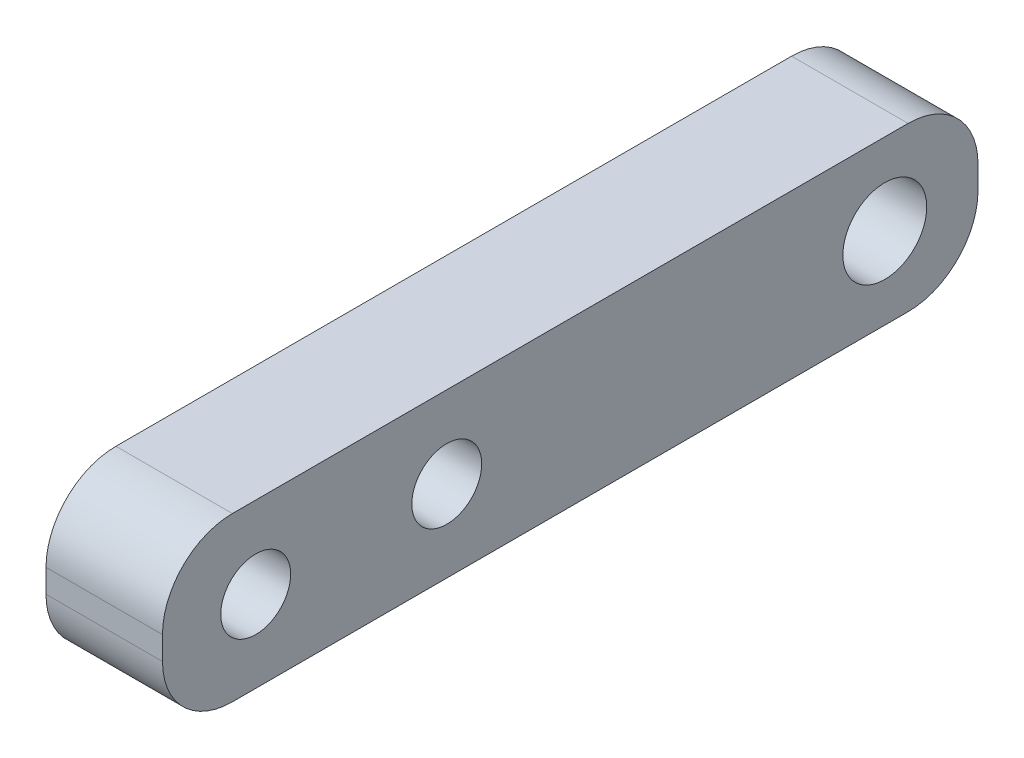
ISO-10303-21;
HEADER;
FILE_DESCRIPTION(('STEP AP214'),'2;1');
FILE_NAME('part.step','',(''),(''),'','','');
FILE_SCHEMA(('AUTOMOTIVE_DESIGN { 1 0 10303 214 1 1 1 1 }'));
ENDSEC;
DATA;
#1=APPLICATION_CONTEXT('core data for automotive mechanical design processes');
#2=APPLICATION_PROTOCOL_DEFINITION('international standard','automotive_design',2000,#1);
#3=PRODUCT_CONTEXT('',#1,'mechanical');
#4=PRODUCT('Part','Part','',(#3));
#5=PRODUCT_RELATED_PRODUCT_CATEGORY('part','',(#4));
#6=PRODUCT_DEFINITION_FORMATION('','',#4);
#7=PRODUCT_DEFINITION_CONTEXT('part definition',#1,'design');
#8=PRODUCT_DEFINITION('design','',#6,#7);
#9=PRODUCT_DEFINITION_SHAPE('','',#8);
#10=(LENGTH_UNIT() NAMED_UNIT(*) SI_UNIT(.MILLI.,.METRE.));
#11=(NAMED_UNIT(*) PLANE_ANGLE_UNIT() SI_UNIT($,.RADIAN.));
#12=(NAMED_UNIT(*) SI_UNIT($,.STERADIAN.) SOLID_ANGLE_UNIT());
#13=UNCERTAINTY_MEASURE_WITH_UNIT(LENGTH_MEASURE(1.E-05),#10,'distance_accuracy_value','');
#14=(GEOMETRIC_REPRESENTATION_CONTEXT(3) GLOBAL_UNCERTAINTY_ASSIGNED_CONTEXT((#13)) GLOBAL_UNIT_ASSIGNED_CONTEXT((#10,
#11,#12)) REPRESENTATION_CONTEXT('',''));
#15=CARTESIAN_POINT('',(0.,0.,0.));
#16=DIRECTION('',(0.,0.,1.));
#17=DIRECTION('',(1.,0.,0.));
#18=AXIS2_PLACEMENT_3D('',#15,#16,#17);
#19=CARTESIAN_POINT('',(5.,0.,0.));
#20=DIRECTION('',(0.,0.,-1.));
#21=DIRECTION('',(0.,1.,0.));
#22=AXIS2_PLACEMENT_3D('',#19,#20,#21);
#23=PLANE('',#22);
#24=DIRECTION('',(0.,-1.,0.));
#25=VECTOR('',#24,1.);
#26=CARTESIAN_POINT('',(5.,0.,0.));
#27=LINE('',#26,#25);
#28=CARTESIAN_POINT('',(5.,-3.,0.));
#29=VERTEX_POINT('',#28);
#30=CARTESIAN_POINT('',(5.,-4.,0.));
#31=VERTEX_POINT('',#30);
#32=EDGE_CURVE('E128',#29,#31,#27,.T.);
#33=ORIENTED_EDGE('',*,*,#32,.F.);
#34=DIRECTION('',(-1.,0.,0.));
#35=VECTOR('',#34,1.);
#36=CARTESIAN_POINT('',(5.,-3.,0.));
#37=LINE('',#36,#35);
#38=CARTESIAN_POINT('',(0.,-3.,0.));
#39=VERTEX_POINT('',#38);
#40=EDGE_CURVE('E11',#29,#39,#37,.T.);
#41=ORIENTED_EDGE('',*,*,#40,.T.);
#42=DIRECTION('',(0.,-1.,0.));
#43=VECTOR('',#42,1.);
#44=CARTESIAN_POINT('',(0.,0.,0.));
#45=LINE('',#44,#43);
#46=CARTESIAN_POINT('',(0.,-4.,0.));
#47=VERTEX_POINT('',#46);
#48=EDGE_CURVE('E130',#39,#47,#45,.T.);
#49=ORIENTED_EDGE('',*,*,#48,.T.);
#50=DIRECTION('',(-1.,0.,0.));
#51=VECTOR('',#50,1.);
#52=CARTESIAN_POINT('',(5.,-4.,0.));
#53=LINE('',#52,#51);
#54=EDGE_CURVE('E41',#47,#31,#53,.F.);
#55=ORIENTED_EDGE('',*,*,#54,.T.);
#56=EDGE_LOOP('',(#33,#41,#49,#55));
#57=FACE_BOUND('',#56,.T.);
#58=ADVANCED_FACE('F33',(#57),#23,.F.);
#59=CARTESIAN_POINT('',(5.,-7.,0.));
#60=DIRECTION('',(0.,1.,0.));
#61=DIRECTION('',(0.,0.,1.));
#62=AXIS2_PLACEMENT_3D('',#59,#60,#61);
#63=PLANE('',#62);
#64=DIRECTION('',(0.,0.,-1.));
#65=VECTOR('',#64,1.);
#66=CARTESIAN_POINT('',(0.,-7.,0.));
#67=LINE('',#66,#65);
#68=CARTESIAN_POINT('',(0.,-7.,-3.));
#69=VERTEX_POINT('',#68);
#70=CARTESIAN_POINT('',(0.,-7.,-32.));
#71=VERTEX_POINT('',#70);
#72=EDGE_CURVE('E126',#69,#71,#67,.T.);
#73=ORIENTED_EDGE('',*,*,#72,.T.);
#74=DIRECTION('',(-1.,0.,0.));
#75=VECTOR('',#74,1.);
#76=CARTESIAN_POINT('',(5.,-7.,-32.));
#77=LINE('',#76,#75);
#78=CARTESIAN_POINT('',(5.,-7.,-32.));
#79=VERTEX_POINT('',#78);
#80=EDGE_CURVE('E105',#71,#79,#77,.F.);
#81=ORIENTED_EDGE('',*,*,#80,.T.);
#82=DIRECTION('',(0.,0.,-1.));
#83=VECTOR('',#82,1.);
#84=CARTESIAN_POINT('',(5.,-7.,0.));
#85=LINE('',#84,#83);
#86=CARTESIAN_POINT('',(5.,-7.,-3.));
#87=VERTEX_POINT('',#86);
#88=EDGE_CURVE('E166',#87,#79,#85,.T.);
#89=ORIENTED_EDGE('',*,*,#88,.F.);
#90=DIRECTION('',(-1.,0.,0.));
#91=VECTOR('',#90,1.);
#92=CARTESIAN_POINT('',(5.,-7.,-3.));
#93=LINE('',#92,#91);
#94=EDGE_CURVE('E110',#87,#69,#93,.T.);
#95=ORIENTED_EDGE('',*,*,#94,.T.);
#96=EDGE_LOOP('',(#73,#81,#89,#95));
#97=FACE_BOUND('',#96,.T.);
#98=ADVANCED_FACE('F170',(#97),#63,.F.);
#99=CARTESIAN_POINT('',(5.,0.,-35.));
#100=DIRECTION('',(0.,0.,1.));
#101=DIRECTION('',(1.,0.,0.));
#102=AXIS2_PLACEMENT_3D('',#99,#100,#101);
#103=PLANE('',#102);
#104=DIRECTION('',(0.,1.,0.));
#105=VECTOR('',#104,1.);
#106=CARTESIAN_POINT('',(5.,0.,-35.));
#107=LINE('',#106,#105);
#108=CARTESIAN_POINT('',(5.,-4.,-35.));
#109=VERTEX_POINT('',#108);
#110=CARTESIAN_POINT('',(5.,-3.,-35.));
#111=VERTEX_POINT('',#110);
#112=EDGE_CURVE('E119',#109,#111,#107,.T.);
#113=ORIENTED_EDGE('',*,*,#112,.F.);
#114=DIRECTION('',(-1.,0.,0.));
#115=VECTOR('',#114,1.);
#116=CARTESIAN_POINT('',(5.,-4.,-35.));
#117=LINE('',#116,#115);
#118=CARTESIAN_POINT('',(0.,-4.,-35.));
#119=VERTEX_POINT('',#118);
#120=EDGE_CURVE('E104',#109,#119,#117,.T.);
#121=ORIENTED_EDGE('',*,*,#120,.T.);
#122=DIRECTION('',(0.,1.,0.));
#123=VECTOR('',#122,1.);
#124=CARTESIAN_POINT('',(0.,0.,-35.));
#125=LINE('',#124,#123);
#126=CARTESIAN_POINT('',(0.,-3.,-35.));
#127=VERTEX_POINT('',#126);
#128=EDGE_CURVE('E117',#119,#127,#125,.T.);
#129=ORIENTED_EDGE('',*,*,#128,.T.);
#130=DIRECTION('',(-1.,0.,0.));
#131=VECTOR('',#130,1.);
#132=CARTESIAN_POINT('',(5.,-3.,-35.));
#133=LINE('',#132,#131);
#134=EDGE_CURVE('E121',#127,#111,#133,.F.);
#135=ORIENTED_EDGE('',*,*,#134,.T.);
#136=EDGE_LOOP('',(#113,#121,#129,#135));
#137=FACE_BOUND('',#136,.T.);
#138=ADVANCED_FACE('F116',(#137),#103,.F.);
#139=CARTESIAN_POINT('',(5.,0.,0.));
#140=DIRECTION('',(0.,-1.,0.));
#141=DIRECTION('',(0.,0.,-1.));
#142=AXIS2_PLACEMENT_3D('',#139,#140,#141);
#143=PLANE('',#142);
#144=DIRECTION('',(0.,0.,1.));
#145=VECTOR('',#144,1.);
#146=CARTESIAN_POINT('',(5.,0.,0.));
#147=LINE('',#146,#145);
#148=CARTESIAN_POINT('',(5.,0.,-32.));
#149=VERTEX_POINT('',#148);
#150=CARTESIAN_POINT('',(5.,0.,-3.));
#151=VERTEX_POINT('',#150);
#152=EDGE_CURVE('E134',#149,#151,#147,.T.);
#153=ORIENTED_EDGE('',*,*,#152,.F.);
#154=DIRECTION('',(-1.,0.,0.));
#155=VECTOR('',#154,1.);
#156=CARTESIAN_POINT('',(5.,0.,-32.));
#157=LINE('',#156,#155);
#158=CARTESIAN_POINT('',(0.,0.,-32.));
#159=VERTEX_POINT('',#158);
#160=EDGE_CURVE('E151',#149,#159,#157,.T.);
#161=ORIENTED_EDGE('',*,*,#160,.T.);
#162=DIRECTION('',(0.,0.,1.));
#163=VECTOR('',#162,1.);
#164=CARTESIAN_POINT('',(0.,0.,0.));
#165=LINE('',#164,#163);
#166=CARTESIAN_POINT('',(0.,0.,-3.));
#167=VERTEX_POINT('',#166);
#168=EDGE_CURVE('E125',#159,#167,#165,.T.);
#169=ORIENTED_EDGE('',*,*,#168,.T.);
#170=DIRECTION('',(-1.,0.,0.));
#171=VECTOR('',#170,1.);
#172=CARTESIAN_POINT('',(5.,0.,-3.));
#173=LINE('',#172,#171);
#174=EDGE_CURVE('E48',#167,#151,#173,.F.);
#175=ORIENTED_EDGE('',*,*,#174,.T.);
#176=EDGE_LOOP('',(#153,#161,#169,#175));
#177=FACE_BOUND('',#176,.T.);
#178=ADVANCED_FACE('F205',(#177),#143,.F.);
#179=CARTESIAN_POINT('',(5.,0.,0.));
#180=DIRECTION('',(1.,0.,0.));
#181=DIRECTION('',(0.,0.,-1.));
#182=AXIS2_PLACEMENT_3D('',#179,#180,#181);
#183=PLANE('',#182);
#184=CARTESIAN_POINT('',(5.,-3.5,-12.2));
#185=DIRECTION('',(1.,0.,0.));
#186=DIRECTION('',(0.,0.,-1.));
#187=AXIS2_PLACEMENT_3D('',#184,#185,#186);
#188=CIRCLE('',#187,1.5);
#189=CARTESIAN_POINT('',(5.,-3.5,-13.7));
#190=VERTEX_POINT('',#189);
#191=EDGE_CURVE('E188',#190,#190,#188,.T.);
#192=ORIENTED_EDGE('',*,*,#191,.F.);
#193=EDGE_LOOP('',(#192));
#194=FACE_BOUND('',#193,.T.);
#195=CARTESIAN_POINT('',(5.,-3.5,-31.));
#196=DIRECTION('',(1.,0.,0.));
#197=DIRECTION('',(0.,0.,-1.));
#198=AXIS2_PLACEMENT_3D('',#195,#196,#197);
#199=CIRCLE('',#198,1.8);
#200=CARTESIAN_POINT('',(5.,-3.5,-32.8));
#201=VERTEX_POINT('',#200);
#202=EDGE_CURVE('E182',#201,#201,#199,.T.);
#203=ORIENTED_EDGE('',*,*,#202,.F.);
#204=EDGE_LOOP('',(#203));
#205=FACE_BOUND('',#204,.T.);
#206=CARTESIAN_POINT('',(5.,-3.5,-4.));
#207=DIRECTION('',(1.,0.,0.));
#208=DIRECTION('',(0.,0.,-1.));
#209=AXIS2_PLACEMENT_3D('',#206,#207,#208);
#210=CIRCLE('',#209,1.5);
#211=CARTESIAN_POINT('',(5.,-3.5,-5.5));
#212=VERTEX_POINT('',#211);
#213=EDGE_CURVE('E173',#212,#212,#210,.T.);
#214=ORIENTED_EDGE('',*,*,#213,.F.);
#215=EDGE_LOOP('',(#214));
#216=FACE_BOUND('',#215,.T.);
#217=ORIENTED_EDGE('',*,*,#88,.T.);
#218=CARTESIAN_POINT('',(5.,-4.,-32.));
#219=DIRECTION('',(1.,0.,0.));
#220=DIRECTION('',(0.,0.,-1.));
#221=AXIS2_PLACEMENT_3D('',#218,#219,#220);
#222=CIRCLE('',#221,3.);
#223=EDGE_CURVE('E148',#79,#109,#222,.T.);
#224=ORIENTED_EDGE('',*,*,#223,.T.);
#225=ORIENTED_EDGE('',*,*,#112,.T.);
#226=CARTESIAN_POINT('',(5.,-3.,-32.));
#227=DIRECTION('',(1.,0.,0.));
#228=DIRECTION('',(0.,0.,-1.));
#229=AXIS2_PLACEMENT_3D('',#226,#227,#228);
#230=CIRCLE('',#229,3.);
#231=EDGE_CURVE('E55',#111,#149,#230,.T.);
#232=ORIENTED_EDGE('',*,*,#231,.T.);
#233=ORIENTED_EDGE('',*,*,#152,.T.);
#234=CARTESIAN_POINT('',(5.,-3.,-3.));
#235=DIRECTION('',(1.,0.,0.));
#236=DIRECTION('',(0.,0.,-1.));
#237=AXIS2_PLACEMENT_3D('',#234,#235,#236);
#238=CIRCLE('',#237,3.);
#239=EDGE_CURVE('E145',#151,#29,#238,.T.);
#240=ORIENTED_EDGE('',*,*,#239,.T.);
#241=ORIENTED_EDGE('',*,*,#32,.T.);
#242=CARTESIAN_POINT('',(5.,-4.,-3.));
#243=DIRECTION('',(1.,0.,0.));
#244=DIRECTION('',(0.,0.,-1.));
#245=AXIS2_PLACEMENT_3D('',#242,#243,#244);
#246=CIRCLE('',#245,3.);
#247=EDGE_CURVE('E143',#31,#87,#246,.T.);
#248=ORIENTED_EDGE('',*,*,#247,.T.);
#249=EDGE_LOOP('',(#217,#224,#225,#232,#233,#240,#241,#248));
#250=FACE_BOUND('',#249,.T.);
#251=ADVANCED_FACE('F163',(#194,#205,#216,#250),#183,.T.);
#252=CARTESIAN_POINT('',(0.,0.,0.));
#253=DIRECTION('',(1.,0.,0.));
#254=DIRECTION('',(0.,0.,-1.));
#255=AXIS2_PLACEMENT_3D('',#252,#253,#254);
#256=PLANE('',#255);
#257=CARTESIAN_POINT('',(0.,-3.5,-12.2));
#258=DIRECTION('',(1.,0.,0.));
#259=DIRECTION('',(0.,0.,-1.));
#260=AXIS2_PLACEMENT_3D('',#257,#258,#259);
#261=CIRCLE('',#260,1.5);
#262=CARTESIAN_POINT('',(0.,-3.5,-13.7));
#263=VERTEX_POINT('',#262);
#264=EDGE_CURVE('E180',#263,#263,#261,.T.);
#265=ORIENTED_EDGE('',*,*,#264,.T.);
#266=EDGE_LOOP('',(#265));
#267=FACE_BOUND('',#266,.T.);
#268=CARTESIAN_POINT('',(0.,-3.5,-31.));
#269=DIRECTION('',(1.,0.,0.));
#270=DIRECTION('',(0.,0.,-1.));
#271=AXIS2_PLACEMENT_3D('',#268,#269,#270);
#272=CIRCLE('',#271,1.8);
#273=CARTESIAN_POINT('',(0.,-3.5,-32.8));
#274=VERTEX_POINT('',#273);
#275=EDGE_CURVE('E185',#274,#274,#272,.T.);
#276=ORIENTED_EDGE('',*,*,#275,.T.);
#277=EDGE_LOOP('',(#276));
#278=FACE_BOUND('',#277,.T.);
#279=CARTESIAN_POINT('',(0.,-3.5,-4.));
#280=DIRECTION('',(1.,0.,0.));
#281=DIRECTION('',(0.,0.,-1.));
#282=AXIS2_PLACEMENT_3D('',#279,#280,#281);
#283=CIRCLE('',#282,1.5);
#284=CARTESIAN_POINT('',(0.,-3.5,-5.5));
#285=VERTEX_POINT('',#284);
#286=EDGE_CURVE('E171',#285,#285,#283,.T.);
#287=ORIENTED_EDGE('',*,*,#286,.T.);
#288=EDGE_LOOP('',(#287));
#289=FACE_BOUND('',#288,.T.);
#290=ORIENTED_EDGE('',*,*,#128,.F.);
#291=CARTESIAN_POINT('',(0.,-4.,-32.));
#292=DIRECTION('',(1.,0.,0.));
#293=DIRECTION('',(0.,0.,-1.));
#294=AXIS2_PLACEMENT_3D('',#291,#292,#293);
#295=CIRCLE('',#294,3.);
#296=EDGE_CURVE('E100',#119,#71,#295,.F.);
#297=ORIENTED_EDGE('',*,*,#296,.T.);
#298=ORIENTED_EDGE('',*,*,#72,.F.);
#299=CARTESIAN_POINT('',(0.,-4.,-3.));
#300=DIRECTION('',(1.,0.,0.));
#301=DIRECTION('',(0.,0.,-1.));
#302=AXIS2_PLACEMENT_3D('',#299,#300,#301);
#303=CIRCLE('',#302,3.);
#304=EDGE_CURVE('E120',#69,#47,#303,.F.);
#305=ORIENTED_EDGE('',*,*,#304,.T.);
#306=ORIENTED_EDGE('',*,*,#48,.F.);
#307=CARTESIAN_POINT('',(0.,-3.,-3.));
#308=DIRECTION('',(1.,0.,0.));
#309=DIRECTION('',(0.,0.,-1.));
#310=AXIS2_PLACEMENT_3D('',#307,#308,#309);
#311=CIRCLE('',#310,3.);
#312=EDGE_CURVE('E137',#39,#167,#311,.F.);
#313=ORIENTED_EDGE('',*,*,#312,.T.);
#314=ORIENTED_EDGE('',*,*,#168,.F.);
#315=CARTESIAN_POINT('',(0.,-3.,-32.));
#316=DIRECTION('',(1.,0.,0.));
#317=DIRECTION('',(0.,0.,-1.));
#318=AXIS2_PLACEMENT_3D('',#315,#316,#317);
#319=CIRCLE('',#318,3.);
#320=EDGE_CURVE('E111',#159,#127,#319,.F.);
#321=ORIENTED_EDGE('',*,*,#320,.T.);
#322=EDGE_LOOP('',(#290,#297,#298,#305,#306,#313,#314,#321));
#323=FACE_BOUND('',#322,.T.);
#324=ADVANCED_FACE('F123',(#267,#278,#289,#323),#256,.F.);
#325=CARTESIAN_POINT('',(0.,-3.5,-4.));
#326=DIRECTION('',(1.,0.,0.));
#327=DIRECTION('',(0.,0.,-1.));
#328=AXIS2_PLACEMENT_3D('',#325,#326,#327);
#329=CYLINDRICAL_SURFACE('',#328,1.5);
#330=ORIENTED_EDGE('',*,*,#286,.F.);
#331=EDGE_LOOP('',(#330));
#332=FACE_BOUND('',#331,.T.);
#333=ORIENTED_EDGE('',*,*,#213,.T.);
#334=EDGE_LOOP('',(#333));
#335=FACE_BOUND('',#334,.T.);
#336=ADVANCED_FACE('F211',(#332,#335),#329,.F.);
#337=CARTESIAN_POINT('',(0.,-3.5,-31.));
#338=DIRECTION('',(1.,0.,0.));
#339=DIRECTION('',(0.,0.,-1.));
#340=AXIS2_PLACEMENT_3D('',#337,#338,#339);
#341=CYLINDRICAL_SURFACE('',#340,1.8);
#342=ORIENTED_EDGE('',*,*,#275,.F.);
#343=EDGE_LOOP('',(#342));
#344=FACE_BOUND('',#343,.T.);
#345=ORIENTED_EDGE('',*,*,#202,.T.);
#346=EDGE_LOOP('',(#345));
#347=FACE_BOUND('',#346,.T.);
#348=ADVANCED_FACE('F199',(#344,#347),#341,.F.);
#349=CARTESIAN_POINT('',(0.,-3.5,-12.2));
#350=DIRECTION('',(1.,0.,0.));
#351=DIRECTION('',(0.,0.,-1.));
#352=AXIS2_PLACEMENT_3D('',#349,#350,#351);
#353=CYLINDRICAL_SURFACE('',#352,1.5);
#354=ORIENTED_EDGE('',*,*,#264,.F.);
#355=EDGE_LOOP('',(#354));
#356=FACE_BOUND('',#355,.T.);
#357=ORIENTED_EDGE('',*,*,#191,.T.);
#358=EDGE_LOOP('',(#357));
#359=FACE_BOUND('',#358,.T.);
#360=ADVANCED_FACE('F196',(#356,#359),#353,.F.);
#361=CARTESIAN_POINT('',(5.,-4.,-32.));
#362=DIRECTION('',(-1.,0.,0.));
#363=DIRECTION('',(0.,0.,1.));
#364=AXIS2_PLACEMENT_3D('',#361,#362,#363);
#365=CYLINDRICAL_SURFACE('',#364,3.);
#366=ORIENTED_EDGE('',*,*,#223,.F.);
#367=ORIENTED_EDGE('',*,*,#80,.F.);
#368=ORIENTED_EDGE('',*,*,#296,.F.);
#369=ORIENTED_EDGE('',*,*,#120,.F.);
#370=EDGE_LOOP('',(#366,#367,#368,#369));
#371=FACE_BOUND('',#370,.T.);
#372=ADVANCED_FACE('F103',(#371),#365,.T.);
#373=CARTESIAN_POINT('',(5.,-3.,-32.));
#374=DIRECTION('',(-1.,0.,0.));
#375=DIRECTION('',(0.,0.,1.));
#376=AXIS2_PLACEMENT_3D('',#373,#374,#375);
#377=CYLINDRICAL_SURFACE('',#376,3.);
#378=ORIENTED_EDGE('',*,*,#231,.F.);
#379=ORIENTED_EDGE('',*,*,#134,.F.);
#380=ORIENTED_EDGE('',*,*,#320,.F.);
#381=ORIENTED_EDGE('',*,*,#160,.F.);
#382=EDGE_LOOP('',(#378,#379,#380,#381));
#383=FACE_BOUND('',#382,.T.);
#384=ADVANCED_FACE('F233',(#383),#377,.T.);
#385=CARTESIAN_POINT('',(5.,-3.,-3.));
#386=DIRECTION('',(-1.,0.,0.));
#387=DIRECTION('',(0.,0.,1.));
#388=AXIS2_PLACEMENT_3D('',#385,#386,#387);
#389=CYLINDRICAL_SURFACE('',#388,3.);
#390=ORIENTED_EDGE('',*,*,#239,.F.);
#391=ORIENTED_EDGE('',*,*,#174,.F.);
#392=ORIENTED_EDGE('',*,*,#312,.F.);
#393=ORIENTED_EDGE('',*,*,#40,.F.);
#394=EDGE_LOOP('',(#390,#391,#392,#393));
#395=FACE_BOUND('',#394,.T.);
#396=ADVANCED_FACE('F235',(#395),#389,.T.);
#397=CARTESIAN_POINT('',(5.,-4.,-3.));
#398=DIRECTION('',(-1.,0.,0.));
#399=DIRECTION('',(0.,0.,1.));
#400=AXIS2_PLACEMENT_3D('',#397,#398,#399);
#401=CYLINDRICAL_SURFACE('',#400,3.);
#402=ORIENTED_EDGE('',*,*,#247,.F.);
#403=ORIENTED_EDGE('',*,*,#54,.F.);
#404=ORIENTED_EDGE('',*,*,#304,.F.);
#405=ORIENTED_EDGE('',*,*,#94,.F.);
#406=EDGE_LOOP('',(#402,#403,#404,#405));
#407=FACE_BOUND('',#406,.T.);
#408=ADVANCED_FACE('F35',(#407),#401,.T.);
#409=CLOSED_SHELL('',(#58,#98,#138,#178,#251,#324,#336,#348,#360,#372,#384,#396,#408));
#410=MANIFOLD_SOLID_BREP('B2',#409);
#411=ADVANCED_BREP_SHAPE_REPRESENTATION('',(#18,#410),#14);
#412=SHAPE_DEFINITION_REPRESENTATION(#9,#411);
ENDSEC;
END-ISO-10303-21;
